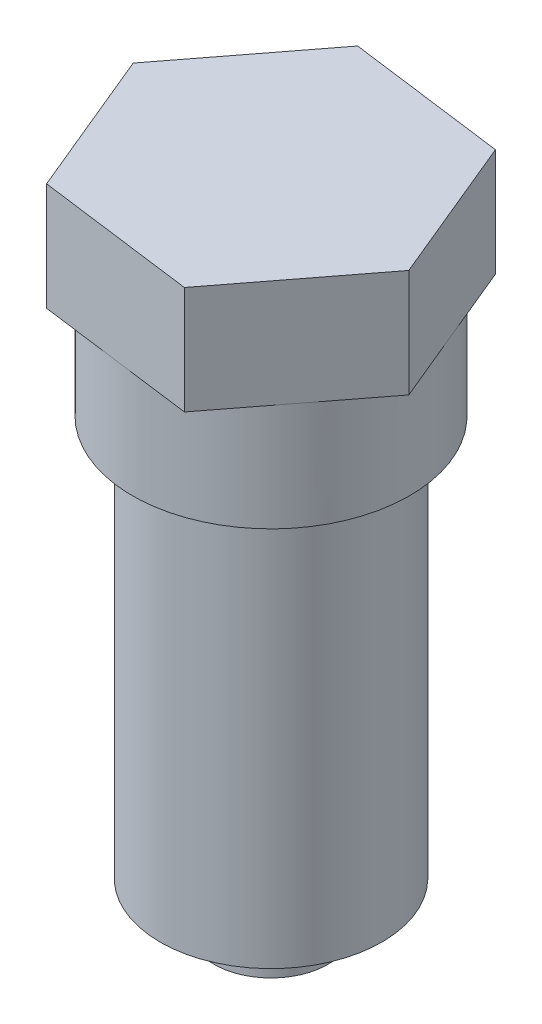
ISO-10303-21;
HEADER;
FILE_DESCRIPTION(('STEP AP214'),'2;1');
FILE_NAME('part.step','',(''),(''),'','','');
FILE_SCHEMA(('AUTOMOTIVE_DESIGN { 1 0 10303 214 1 1 1 1 }'));
ENDSEC;
DATA;
#1=APPLICATION_CONTEXT('core data for automotive mechanical design processes');
#2=APPLICATION_PROTOCOL_DEFINITION('international standard','automotive_design',2000,#1);
#3=PRODUCT_CONTEXT('',#1,'mechanical');
#4=PRODUCT('Part','Part','',(#3));
#5=PRODUCT_RELATED_PRODUCT_CATEGORY('part','',(#4));
#6=PRODUCT_DEFINITION_FORMATION('','',#4);
#7=PRODUCT_DEFINITION_CONTEXT('part definition',#1,'design');
#8=PRODUCT_DEFINITION('design','',#6,#7);
#9=PRODUCT_DEFINITION_SHAPE('','',#8);
#10=(LENGTH_UNIT() NAMED_UNIT(*) SI_UNIT(.MILLI.,.METRE.));
#11=(NAMED_UNIT(*) PLANE_ANGLE_UNIT() SI_UNIT($,.RADIAN.));
#12=(NAMED_UNIT(*) SI_UNIT($,.STERADIAN.) SOLID_ANGLE_UNIT());
#13=UNCERTAINTY_MEASURE_WITH_UNIT(LENGTH_MEASURE(1.E-05),#10,'distance_accuracy_value','');
#14=(GEOMETRIC_REPRESENTATION_CONTEXT(3) GLOBAL_UNCERTAINTY_ASSIGNED_CONTEXT((#13)) GLOBAL_UNIT_ASSIGNED_CONTEXT((#10,
#11,#12)) REPRESENTATION_CONTEXT('',''));
#15=CARTESIAN_POINT('',(0.,0.,0.));
#16=DIRECTION('',(0.,0.,1.));
#17=DIRECTION('',(1.,0.,0.));
#18=AXIS2_PLACEMENT_3D('',#15,#16,#17);
#19=CARTESIAN_POINT('',(0.,0.,0.));
#20=DIRECTION('',(0.,1.,0.));
#21=DIRECTION('',(0.,0.,1.));
#22=AXIS2_PLACEMENT_3D('',#19,#20,#21);
#23=PLANE('',#22);
#24=CARTESIAN_POINT('',(0.,0.,0.));
#25=DIRECTION('',(0.,-1.,0.));
#26=DIRECTION('',(0.,0.,-1.));
#27=AXIS2_PLACEMENT_3D('',#24,#25,#26);
#28=CIRCLE('',#27,9.);
#29=CARTESIAN_POINT('',(1.17416474249469,0.,-8.92307890570751));
#30=VERTEX_POINT('',#29);
#31=CARTESIAN_POINT('',(8.3146953835631,0.,-3.44468295762535));
#32=VERTEX_POINT('',#31);
#33=EDGE_CURVE('E140',#30,#32,#28,.T.);
#34=ORIENTED_EDGE('',*,*,#33,.F.);
#35=DIRECTION('',(-0.991453211745279,0.,-0.130462749166077));
#36=VECTOR('',#35,1.);
#37=CARTESIAN_POINT('',(6.32590675070519,0.,-8.24517457555524));
#38=LINE('',#37,#36);
#39=CARTESIAN_POINT('',(6.32590675070519,0.,-8.24517457555524));
#40=VERTEX_POINT('',#39);
#41=EDGE_CURVE('E122',#40,#30,#38,.T.);
#42=ORIENTED_EDGE('',*,*,#41,.F.);
#43=DIRECTION('',(-0.382742550847261,0.,-0.923855042618122));
#44=VECTOR('',#43,1.);
#45=CARTESIAN_POINT('',(10.303484016421,0.,1.35580866030455));
#46=LINE('',#45,#44);
#47=EDGE_CURVE('E141',#32,#40,#46,.T.);
#48=ORIENTED_EDGE('',*,*,#47,.F.);
#49=EDGE_LOOP('',(#34,#42,#48));
#50=FACE_BOUND('',#49,.T.);
#51=ADVANCED_FACE('F45',(#50),#23,.F.);
#52=CARTESIAN_POINT('',(7.14053064106841,0.,5.47839594808217));
#53=VERTEX_POINT('',#52);
#54=EDGE_CURVE('E149',#32,#53,#28,.T.);
#55=ORIENTED_EDGE('',*,*,#54,.F.);
#56=CARTESIAN_POINT('',(10.303484016421,0.,1.35580866030455));
#57=VERTEX_POINT('',#56);
#58=EDGE_CURVE('E138',#57,#32,#46,.T.);
#59=ORIENTED_EDGE('',*,*,#58,.F.);
#60=DIRECTION('',(0.608710660898019,0.,-0.793392293452046));
#61=VECTOR('',#60,1.);
#62=CARTESIAN_POINT('',(3.97757726571581,0.,9.60098323585979));
#63=LINE('',#62,#61);
#64=EDGE_CURVE('E195',#53,#57,#63,.T.);
#65=ORIENTED_EDGE('',*,*,#64,.F.);
#66=EDGE_LOOP('',(#55,#59,#65));
#67=FACE_BOUND('',#66,.T.);
#68=ADVANCED_FACE('F245',(#67),#23,.F.);
#69=CARTESIAN_POINT('',(-1.17416474249469,0.,8.92307890570751));
#70=VERTEX_POINT('',#69);
#71=EDGE_CURVE('E286',#53,#70,#28,.T.);
#72=ORIENTED_EDGE('',*,*,#71,.F.);
#73=CARTESIAN_POINT('',(3.97757726571581,0.,9.60098323585979));
#74=VERTEX_POINT('',#73);
#75=EDGE_CURVE('E165',#74,#53,#63,.T.);
#76=ORIENTED_EDGE('',*,*,#75,.F.);
#77=DIRECTION('',(0.991453211745279,0.,0.130462749166076));
#78=VECTOR('',#77,1.);
#79=CARTESIAN_POINT('',(-6.32590675070519,0.,8.24517457555524));
#80=LINE('',#79,#78);
#81=EDGE_CURVE('E190',#70,#74,#80,.T.);
#82=ORIENTED_EDGE('',*,*,#81,.F.);
#83=EDGE_LOOP('',(#72,#76,#82));
#84=FACE_BOUND('',#83,.T.);
#85=ADVANCED_FACE('F250',(#84),#23,.F.);
#86=CARTESIAN_POINT('',(-8.3146953835631,0.,3.44468295762534));
#87=VERTEX_POINT('',#86);
#88=EDGE_CURVE('E155',#70,#87,#28,.T.);
#89=ORIENTED_EDGE('',*,*,#88,.F.);
#90=CARTESIAN_POINT('',(-6.32590675070519,0.,8.24517457555524));
#91=VERTEX_POINT('',#90);
#92=EDGE_CURVE('E191',#91,#70,#80,.T.);
#93=ORIENTED_EDGE('',*,*,#92,.F.);
#94=DIRECTION('',(0.38274255084726,0.,0.923855042618122));
#95=VECTOR('',#94,1.);
#96=CARTESIAN_POINT('',(-10.303484016421,0.,-1.35580866030455));
#97=LINE('',#96,#95);
#98=EDGE_CURVE('E185',#87,#91,#97,.T.);
#99=ORIENTED_EDGE('',*,*,#98,.F.);
#100=EDGE_LOOP('',(#89,#93,#99));
#101=FACE_BOUND('',#100,.T.);
#102=ADVANCED_FACE('F273',(#101),#23,.F.);
#103=CARTESIAN_POINT('',(-7.14053064106841,0.,-5.47839594808217));
#104=VERTEX_POINT('',#103);
#105=EDGE_CURVE('E70',#87,#104,#28,.T.);
#106=ORIENTED_EDGE('',*,*,#105,.F.);
#107=CARTESIAN_POINT('',(-10.303484016421,0.,-1.35580866030455));
#108=VERTEX_POINT('',#107);
#109=EDGE_CURVE('E186',#108,#87,#97,.T.);
#110=ORIENTED_EDGE('',*,*,#109,.F.);
#111=DIRECTION('',(-0.608710660898019,0.,0.793392293452046));
#112=VECTOR('',#111,1.);
#113=CARTESIAN_POINT('',(-3.97757726571582,0.,-9.60098323585979));
#114=LINE('',#113,#112);
#115=EDGE_CURVE('E132',#104,#108,#114,.T.);
#116=ORIENTED_EDGE('',*,*,#115,.F.);
#117=EDGE_LOOP('',(#106,#110,#116));
#118=FACE_BOUND('',#117,.T.);
#119=ADVANCED_FACE('F242',(#118),#23,.F.);
#120=CARTESIAN_POINT('',(10.303484016421,7.,1.35580866030455));
#121=DIRECTION('',(-0.923855042618122,0.,0.382742550847261));
#122=DIRECTION('',(0.382742550847261,0.,0.923855042618122));
#123=AXIS2_PLACEMENT_3D('',#120,#121,#122);
#124=PLANE('',#123);
#125=ORIENTED_EDGE('',*,*,#58,.T.);
#126=ORIENTED_EDGE('',*,*,#47,.T.);
#127=DIRECTION('',(0.,-1.,0.));
#128=VECTOR('',#127,1.);
#129=CARTESIAN_POINT('',(6.32590675070519,7.,-8.24517457555524));
#130=LINE('',#129,#128);
#131=CARTESIAN_POINT('',(6.32590675070519,7.,-8.24517457555524));
#132=VERTEX_POINT('',#131);
#133=EDGE_CURVE('E49',#132,#40,#130,.T.);
#134=ORIENTED_EDGE('',*,*,#133,.F.);
#135=DIRECTION('',(-0.382742550847261,0.,-0.923855042618122));
#136=VECTOR('',#135,1.);
#137=CARTESIAN_POINT('',(10.303484016421,7.,1.35580866030455));
#138=LINE('',#137,#136);
#139=CARTESIAN_POINT('',(10.303484016421,7.,1.35580866030455));
#140=VERTEX_POINT('',#139);
#141=EDGE_CURVE('E160',#140,#132,#138,.T.);
#142=ORIENTED_EDGE('',*,*,#141,.F.);
#143=DIRECTION('',(0.,-1.,0.));
#144=VECTOR('',#143,1.);
#145=CARTESIAN_POINT('',(10.303484016421,7.,1.35580866030455));
#146=LINE('',#145,#144);
#147=EDGE_CURVE('E180',#140,#57,#146,.T.);
#148=ORIENTED_EDGE('',*,*,#147,.T.);
#149=EDGE_LOOP('',(#125,#126,#134,#142,#148));
#150=FACE_BOUND('',#149,.T.);
#151=ADVANCED_FACE('F47',(#150),#124,.F.);
#152=CARTESIAN_POINT('',(6.32590675070519,7.,-8.24517457555524));
#153=DIRECTION('',(-0.130462749166077,0.,0.991453211745279));
#154=DIRECTION('',(0.991453211745279,0.,0.130462749166077));
#155=AXIS2_PLACEMENT_3D('',#152,#153,#154);
#156=PLANE('',#155);
#157=ORIENTED_EDGE('',*,*,#41,.T.);
#158=CARTESIAN_POINT('',(-3.97757726571582,0.,-9.60098323585979));
#159=VERTEX_POINT('',#158);
#160=EDGE_CURVE('E125',#30,#159,#38,.T.);
#161=ORIENTED_EDGE('',*,*,#160,.T.);
#162=DIRECTION('',(0.,-1.,0.));
#163=VECTOR('',#162,1.);
#164=CARTESIAN_POINT('',(-3.97757726571582,7.,-9.60098323585979));
#165=LINE('',#164,#163);
#166=CARTESIAN_POINT('',(-3.97757726571582,7.,-9.60098323585979));
#167=VERTEX_POINT('',#166);
#168=EDGE_CURVE('E156',#167,#159,#165,.T.);
#169=ORIENTED_EDGE('',*,*,#168,.F.);
#170=DIRECTION('',(-0.991453211745279,0.,-0.130462749166077));
#171=VECTOR('',#170,1.);
#172=CARTESIAN_POINT('',(6.32590675070519,7.,-8.24517457555524));
#173=LINE('',#172,#171);
#174=EDGE_CURVE('E164',#132,#167,#173,.T.);
#175=ORIENTED_EDGE('',*,*,#174,.F.);
#176=ORIENTED_EDGE('',*,*,#133,.T.);
#177=EDGE_LOOP('',(#157,#161,#169,#175,#176));
#178=FACE_BOUND('',#177,.T.);
#179=ADVANCED_FACE('F123',(#178),#156,.F.);
#180=CARTESIAN_POINT('',(-3.97757726571582,7.,-9.60098323585979));
#181=DIRECTION('',(0.793392293452046,0.,0.608710660898019));
#182=DIRECTION('',(0.608710660898019,0.,-0.793392293452046));
#183=AXIS2_PLACEMENT_3D('',#180,#181,#182);
#184=PLANE('',#183);
#185=EDGE_CURVE('E136',#159,#104,#114,.T.);
#186=ORIENTED_EDGE('',*,*,#185,.T.);
#187=ORIENTED_EDGE('',*,*,#115,.T.);
#188=DIRECTION('',(0.,-1.,0.));
#189=VECTOR('',#188,1.);
#190=CARTESIAN_POINT('',(-10.303484016421,7.,-1.35580866030455));
#191=LINE('',#190,#189);
#192=CARTESIAN_POINT('',(-10.303484016421,7.,-1.35580866030455));
#193=VERTEX_POINT('',#192);
#194=EDGE_CURVE('E210',#193,#108,#191,.T.);
#195=ORIENTED_EDGE('',*,*,#194,.F.);
#196=DIRECTION('',(-0.608710660898019,0.,0.793392293452046));
#197=VECTOR('',#196,1.);
#198=CARTESIAN_POINT('',(-3.97757726571582,7.,-9.60098323585979));
#199=LINE('',#198,#197);
#200=EDGE_CURVE('E168',#167,#193,#199,.T.);
#201=ORIENTED_EDGE('',*,*,#200,.F.);
#202=ORIENTED_EDGE('',*,*,#168,.T.);
#203=EDGE_LOOP('',(#186,#187,#195,#201,#202));
#204=FACE_BOUND('',#203,.T.);
#205=ADVANCED_FACE('F216',(#204),#184,.F.);
#206=CARTESIAN_POINT('',(-10.303484016421,7.,-1.35580866030455));
#207=DIRECTION('',(0.923855042618122,0.,-0.38274255084726));
#208=DIRECTION('',(-0.38274255084726,0.,-0.923855042618122));
#209=AXIS2_PLACEMENT_3D('',#206,#207,#208);
#210=PLANE('',#209);
#211=ORIENTED_EDGE('',*,*,#109,.T.);
#212=ORIENTED_EDGE('',*,*,#98,.T.);
#213=DIRECTION('',(0.,-1.,0.));
#214=VECTOR('',#213,1.);
#215=CARTESIAN_POINT('',(-6.32590675070519,7.,8.24517457555524));
#216=LINE('',#215,#214);
#217=CARTESIAN_POINT('',(-6.32590675070519,7.,8.24517457555524));
#218=VERTEX_POINT('',#217);
#219=EDGE_CURVE('E206',#218,#91,#216,.T.);
#220=ORIENTED_EDGE('',*,*,#219,.F.);
#221=DIRECTION('',(0.38274255084726,0.,0.923855042618122));
#222=VECTOR('',#221,1.);
#223=CARTESIAN_POINT('',(-10.303484016421,7.,-1.35580866030455));
#224=LINE('',#223,#222);
#225=EDGE_CURVE('E171',#193,#218,#224,.T.);
#226=ORIENTED_EDGE('',*,*,#225,.F.);
#227=ORIENTED_EDGE('',*,*,#194,.T.);
#228=EDGE_LOOP('',(#211,#212,#220,#226,#227));
#229=FACE_BOUND('',#228,.T.);
#230=ADVANCED_FACE('F260',(#229),#210,.F.);
#231=CARTESIAN_POINT('',(-6.32590675070519,7.,8.24517457555524));
#232=DIRECTION('',(0.130462749166076,0.,-0.991453211745279));
#233=DIRECTION('',(-0.991453211745279,0.,-0.130462749166076));
#234=AXIS2_PLACEMENT_3D('',#231,#232,#233);
#235=PLANE('',#234);
#236=ORIENTED_EDGE('',*,*,#92,.T.);
#237=ORIENTED_EDGE('',*,*,#81,.T.);
#238=DIRECTION('',(0.,-1.,0.));
#239=VECTOR('',#238,1.);
#240=CARTESIAN_POINT('',(3.97757726571581,7.,9.60098323585979));
#241=LINE('',#240,#239);
#242=CARTESIAN_POINT('',(3.97757726571581,7.,9.60098323585979));
#243=VERTEX_POINT('',#242);
#244=EDGE_CURVE('E202',#243,#74,#241,.T.);
#245=ORIENTED_EDGE('',*,*,#244,.F.);
#246=DIRECTION('',(0.991453211745279,0.,0.130462749166076));
#247=VECTOR('',#246,1.);
#248=CARTESIAN_POINT('',(-6.32590675070519,7.,8.24517457555524));
#249=LINE('',#248,#247);
#250=EDGE_CURVE('E174',#218,#243,#249,.T.);
#251=ORIENTED_EDGE('',*,*,#250,.F.);
#252=ORIENTED_EDGE('',*,*,#219,.T.);
#253=EDGE_LOOP('',(#236,#237,#245,#251,#252));
#254=FACE_BOUND('',#253,.T.);
#255=ADVANCED_FACE('F256',(#254),#235,.F.);
#256=CARTESIAN_POINT('',(3.97757726571581,7.,9.60098323585979));
#257=DIRECTION('',(-0.793392293452046,0.,-0.608710660898019));
#258=DIRECTION('',(-0.608710660898019,0.,0.793392293452046));
#259=AXIS2_PLACEMENT_3D('',#256,#257,#258);
#260=PLANE('',#259);
#261=ORIENTED_EDGE('',*,*,#75,.T.);
#262=ORIENTED_EDGE('',*,*,#64,.T.);
#263=ORIENTED_EDGE('',*,*,#147,.F.);
#264=DIRECTION('',(0.608710660898019,0.,-0.793392293452046));
#265=VECTOR('',#264,1.);
#266=CARTESIAN_POINT('',(3.97757726571581,7.,9.60098323585979));
#267=LINE('',#266,#265);
#268=EDGE_CURVE('E177',#243,#140,#267,.T.);
#269=ORIENTED_EDGE('',*,*,#268,.F.);
#270=ORIENTED_EDGE('',*,*,#244,.T.);
#271=EDGE_LOOP('',(#261,#262,#263,#269,#270));
#272=FACE_BOUND('',#271,.T.);
#273=ADVANCED_FACE('F253',(#272),#260,.F.);
#274=CARTESIAN_POINT('',(0.,7.,0.));
#275=DIRECTION('',(0.,1.,0.));
#276=DIRECTION('',(0.,0.,1.));
#277=AXIS2_PLACEMENT_3D('',#274,#275,#276);
#278=PLANE('',#277);
#279=ORIENTED_EDGE('',*,*,#141,.T.);
#280=ORIENTED_EDGE('',*,*,#174,.T.);
#281=ORIENTED_EDGE('',*,*,#200,.T.);
#282=ORIENTED_EDGE('',*,*,#225,.T.);
#283=ORIENTED_EDGE('',*,*,#250,.T.);
#284=ORIENTED_EDGE('',*,*,#268,.T.);
#285=EDGE_LOOP('',(#279,#280,#281,#282,#283,#284));
#286=FACE_BOUND('',#285,.T.);
#287=ADVANCED_FACE('F220',(#286),#278,.T.);
#288=EDGE_CURVE('E63',#104,#30,#28,.T.);
#289=ORIENTED_EDGE('',*,*,#288,.F.);
#290=ORIENTED_EDGE('',*,*,#185,.F.);
#291=ORIENTED_EDGE('',*,*,#160,.F.);
#292=EDGE_LOOP('',(#289,#290,#291));
#293=FACE_BOUND('',#292,.T.);
#294=ADVANCED_FACE('F134',(#293),#23,.F.);
#295=CARTESIAN_POINT('',(0.,-7.,0.));
#296=DIRECTION('',(0.,1.,0.));
#297=DIRECTION('',(0.,0.,1.));
#298=AXIS2_PLACEMENT_3D('',#295,#296,#297);
#299=CYLINDRICAL_SURFACE('',#298,9.);
#300=CARTESIAN_POINT('',(0.,-7.,0.));
#301=DIRECTION('',(0.,-1.,0.));
#302=DIRECTION('',(0.,0.,-1.));
#303=AXIS2_PLACEMENT_3D('',#300,#301,#302);
#304=CIRCLE('',#303,9.);
#305=CARTESIAN_POINT('',(0.,-7.,-9.));
#306=VERTEX_POINT('',#305);
#307=EDGE_CURVE('E146',#306,#306,#304,.T.);
#308=ORIENTED_EDGE('',*,*,#307,.F.);
#309=EDGE_LOOP('',(#308));
#310=FACE_BOUND('',#309,.T.);
#311=ORIENTED_EDGE('',*,*,#33,.T.);
#312=ORIENTED_EDGE('',*,*,#54,.T.);
#313=ORIENTED_EDGE('',*,*,#71,.T.);
#314=ORIENTED_EDGE('',*,*,#88,.T.);
#315=ORIENTED_EDGE('',*,*,#105,.T.);
#316=ORIENTED_EDGE('',*,*,#288,.T.);
#317=EDGE_LOOP('',(#311,#312,#313,#314,#315,#316));
#318=FACE_BOUND('',#317,.T.);
#319=ADVANCED_FACE('F150',(#310,#318),#299,.T.);
#320=CARTESIAN_POINT('',(0.,-7.,0.));
#321=DIRECTION('',(0.,-1.,0.));
#322=DIRECTION('',(0.,0.,-1.));
#323=AXIS2_PLACEMENT_3D('',#320,#321,#322);
#324=PLANE('',#323);
#325=CARTESIAN_POINT('',(0.,-7.,0.));
#326=DIRECTION('',(0.,-1.,0.));
#327=DIRECTION('',(0.,0.,-1.));
#328=AXIS2_PLACEMENT_3D('',#325,#326,#327);
#329=CIRCLE('',#328,7.2);
#330=CARTESIAN_POINT('',(0.,-7.,7.2));
#331=VERTEX_POINT('',#330);
#332=EDGE_CURVE('E55',#331,#331,#329,.T.);
#333=ORIENTED_EDGE('',*,*,#332,.F.);
#334=EDGE_LOOP('',(#333));
#335=FACE_BOUND('',#334,.T.);
#336=ORIENTED_EDGE('',*,*,#307,.T.);
#337=EDGE_LOOP('',(#336));
#338=FACE_BOUND('',#337,.T.);
#339=ADVANCED_FACE('F230',(#335,#338),#324,.T.);
#340=CARTESIAN_POINT('',(0.,-33.,0.));
#341=DIRECTION('',(0.,1.,0.));
#342=DIRECTION('',(0.,0.,1.));
#343=AXIS2_PLACEMENT_3D('',#340,#341,#342);
#344=CYLINDRICAL_SURFACE('',#343,7.2);
#345=CARTESIAN_POINT('',(0.,-33.,0.));
#346=DIRECTION('',(0.,-1.,0.));
#347=DIRECTION('',(0.,0.,-1.));
#348=AXIS2_PLACEMENT_3D('',#345,#346,#347);
#349=CIRCLE('',#348,7.2);
#350=CARTESIAN_POINT('',(0.,-33.,7.2));
#351=VERTEX_POINT('',#350);
#352=EDGE_CURVE('E147',#351,#351,#349,.T.);
#353=CARTESIAN_POINT('',(0.,-33.,7.2));
#354=CARTESIAN_POINT('',(0.,-32.7291666666667,7.2));
#355=CARTESIAN_POINT('',(0.,-32.4583333333333,7.2));
#356=CARTESIAN_POINT('',(0.,-31.9166666666667,7.2));
#357=CARTESIAN_POINT('',(0.,-31.6458333333333,7.2));
#358=CARTESIAN_POINT('',(0.,-31.1041666666667,7.2));
#359=CARTESIAN_POINT('',(0.,-30.8333333333333,7.2));
#360=CARTESIAN_POINT('',(0.,-30.2916666666667,7.2));
#361=CARTESIAN_POINT('',(0.,-30.0208333333333,7.2));
#362=CARTESIAN_POINT('',(0.,-29.4791666666667,7.2));
#363=CARTESIAN_POINT('',(0.,-29.2083333333333,7.2));
#364=CARTESIAN_POINT('',(0.,-28.6666666666667,7.2));
#365=CARTESIAN_POINT('',(0.,-28.3958333333333,7.2));
#366=CARTESIAN_POINT('',(0.,-27.8541666666667,7.2));
#367=CARTESIAN_POINT('',(0.,-27.5833333333333,7.2));
#368=CARTESIAN_POINT('',(0.,-27.0416666666667,7.2));
#369=CARTESIAN_POINT('',(0.,-26.7708333333333,7.2));
#370=CARTESIAN_POINT('',(0.,-26.2291666666667,7.2));
#371=CARTESIAN_POINT('',(0.,-25.9583333333333,7.2));
#372=CARTESIAN_POINT('',(0.,-25.4166666666667,7.2));
#373=CARTESIAN_POINT('',(0.,-25.1458333333333,7.2));
#374=CARTESIAN_POINT('',(0.,-24.6041666666667,7.2));
#375=CARTESIAN_POINT('',(0.,-24.3333333333333,7.2));
#376=CARTESIAN_POINT('',(0.,-23.7916666666667,7.2));
#377=CARTESIAN_POINT('',(0.,-23.5208333333333,7.2));
#378=CARTESIAN_POINT('',(0.,-22.9791666666667,7.2));
#379=CARTESIAN_POINT('',(0.,-22.7083333333333,7.2));
#380=CARTESIAN_POINT('',(0.,-22.1666666666667,7.2));
#381=CARTESIAN_POINT('',(0.,-21.8958333333333,7.2));
#382=CARTESIAN_POINT('',(0.,-21.3541666666667,7.2));
#383=CARTESIAN_POINT('',(0.,-21.0833333333333,7.2));
#384=CARTESIAN_POINT('',(0.,-20.5416666666667,7.2));
#385=CARTESIAN_POINT('',(0.,-20.2708333333333,7.2));
#386=CARTESIAN_POINT('',(0.,-19.7291666666667,7.2));
#387=CARTESIAN_POINT('',(0.,-19.4583333333333,7.2));
#388=CARTESIAN_POINT('',(0.,-18.9166666666667,7.2));
#389=CARTESIAN_POINT('',(0.,-18.6458333333333,7.2));
#390=CARTESIAN_POINT('',(0.,-18.1041666666667,7.2));
#391=CARTESIAN_POINT('',(0.,-17.8333333333333,7.2));
#392=CARTESIAN_POINT('',(0.,-17.2916666666667,7.2));
#393=CARTESIAN_POINT('',(0.,-17.0208333333333,7.2));
#394=CARTESIAN_POINT('',(0.,-16.4791666666667,7.2));
#395=CARTESIAN_POINT('',(0.,-16.2083333333333,7.2));
#396=CARTESIAN_POINT('',(0.,-15.6666666666667,7.2));
#397=CARTESIAN_POINT('',(0.,-15.3958333333333,7.2));
#398=CARTESIAN_POINT('',(0.,-14.8541666666667,7.2));
#399=CARTESIAN_POINT('',(0.,-14.5833333333333,7.2));
#400=CARTESIAN_POINT('',(0.,-14.0416666666667,7.2));
#401=CARTESIAN_POINT('',(0.,-13.7708333333333,7.2));
#402=CARTESIAN_POINT('',(0.,-13.2291666666667,7.2));
#403=CARTESIAN_POINT('',(0.,-12.9583333333333,7.2));
#404=CARTESIAN_POINT('',(0.,-12.4166666666667,7.2));
#405=CARTESIAN_POINT('',(0.,-12.1458333333333,7.2));
#406=CARTESIAN_POINT('',(0.,-11.6041666666667,7.2));
#407=CARTESIAN_POINT('',(0.,-11.3333333333333,7.2));
#408=CARTESIAN_POINT('',(0.,-10.7916666666667,7.2));
#409=CARTESIAN_POINT('',(0.,-10.5208333333333,7.2));
#410=CARTESIAN_POINT('',(0.,-9.97916666666667,7.2));
#411=CARTESIAN_POINT('',(0.,-9.70833333333333,7.2));
#412=CARTESIAN_POINT('',(0.,-9.16666666666667,7.2));
#413=CARTESIAN_POINT('',(0.,-8.89583333333334,7.2));
#414=CARTESIAN_POINT('',(0.,-8.35416666666667,7.2));
#415=CARTESIAN_POINT('',(0.,-8.08333333333334,7.2));
#416=CARTESIAN_POINT('',(0.,-7.54166666666667,7.2));
#417=CARTESIAN_POINT('',(0.,-7.27083333333334,7.2));
#418=CARTESIAN_POINT('',(0.,-7.,7.2));
#419=B_SPLINE_CURVE_WITH_KNOTS('',3,(#353,#354,#355,#356,#357,#358,#359,#360,#361,#362,#363,
#364,#365,#366,#367,#368,#369,#370,#371,#372,#373,#374,#375,#376,#377,#378,#379,#380,#381,#382,
#383,#384,#385,#386,#387,#388,#389,#390,#391,#392,#393,#394,#395,#396,#397,#398,#399,#400,#401,
#402,#403,#404,#405,#406,#407,#408,#409,#410,#411,#412,#413,#414,#415,#416,#417,#418),
.UNSPECIFIED.,.F.,.F.,(4,2,2,2,2,2,2,2,2,2,2,2,2,2,2,2,2,2,2,2,2,2,2,2,2,2,2,2,2,2,2,2,4),(0.,
0.812500000000001,1.625,2.4375,3.25,4.0625,4.875,5.6875,6.5,7.3125,8.125,8.9375,9.75,10.5625,
11.375,12.1875,13.,13.8125,14.625,15.4375,16.25,17.0625,17.875,18.6875,19.5,20.3125,21.125,
21.9375,22.75,23.5625,24.375,25.1875,26.),.UNSPECIFIED.);
#420=EDGE_CURVE('BSEAM238',#351,#331,#419,.T.);
#421=ORIENTED_EDGE('',*,*,#352,.F.);
#422=ORIENTED_EDGE('',*,*,#332,.T.);
#423=ORIENTED_EDGE('',*,*,#420,.T.);
#424=ORIENTED_EDGE('',*,*,#420,.F.);
#425=EDGE_LOOP('',(#421,#423,#422,#424));
#426=FACE_BOUND('',#425,.T.);
#427=ADVANCED_FACE('F238',(#426),#344,.T.);
#428=CARTESIAN_POINT('',(0.,-33.,0.));
#429=DIRECTION('',(0.,-1.,0.));
#430=DIRECTION('',(0.,0.,-1.));
#431=AXIS2_PLACEMENT_3D('',#428,#429,#430);
#432=PLANE('',#431);
#433=CARTESIAN_POINT('',(0.,-33.,0.));
#434=DIRECTION('',(0.,-1.,0.));
#435=DIRECTION('',(0.,0.,-1.));
#436=AXIS2_PLACEMENT_3D('',#433,#434,#435);
#437=CIRCLE('',#436,3.7);
#438=CARTESIAN_POINT('',(0.,-33.,-3.7));
#439=VERTEX_POINT('',#438);
#440=EDGE_CURVE('E11',#439,#439,#437,.T.);
#441=ORIENTED_EDGE('',*,*,#440,.F.);
#442=EDGE_LOOP('',(#441));
#443=FACE_BOUND('',#442,.T.);
#444=ORIENTED_EDGE('',*,*,#352,.T.);
#445=EDGE_LOOP('',(#444));
#446=FACE_BOUND('',#445,.T.);
#447=ADVANCED_FACE('F313',(#443,#446),#432,.T.);
#448=CARTESIAN_POINT('',(0.,-36.,0.));
#449=DIRECTION('',(0.,1.,0.));
#450=DIRECTION('',(0.,0.,1.));
#451=AXIS2_PLACEMENT_3D('',#448,#449,#450);
#452=CYLINDRICAL_SURFACE('',#451,3.7);
#453=CARTESIAN_POINT('',(0.,-36.,0.));
#454=DIRECTION('',(0.,-1.,0.));
#455=DIRECTION('',(0.,0.,-1.));
#456=AXIS2_PLACEMENT_3D('',#453,#454,#455);
#457=CIRCLE('',#456,3.7);
#458=CARTESIAN_POINT('',(0.,-36.,-3.7));
#459=VERTEX_POINT('',#458);
#460=EDGE_CURVE('E302',#459,#459,#457,.T.);
#461=ORIENTED_EDGE('',*,*,#460,.F.);
#462=EDGE_LOOP('',(#461));
#463=FACE_BOUND('',#462,.T.);
#464=ORIENTED_EDGE('',*,*,#440,.T.);
#465=EDGE_LOOP('',(#464));
#466=FACE_BOUND('',#465,.T.);
#467=ADVANCED_FACE('F310',(#463,#466),#452,.T.);
#468=CARTESIAN_POINT('',(0.,-36.,0.));
#469=DIRECTION('',(0.,-1.,0.));
#470=DIRECTION('',(0.,0.,-1.));
#471=AXIS2_PLACEMENT_3D('',#468,#469,#470);
#472=PLANE('',#471);
#473=ORIENTED_EDGE('',*,*,#460,.T.);
#474=EDGE_LOOP('',(#473));
#475=FACE_BOUND('',#474,.T.);
#476=ADVANCED_FACE('F308',(#475),#472,.T.);
#477=CLOSED_SHELL('',(#51,#68,#85,#102,#119,#151,#179,#205,#230,#255,#273,#287,#294,#319,#339,
#427,#447,#467,#476));
#478=MANIFOLD_SOLID_BREP('B2',#477);
#479=ADVANCED_BREP_SHAPE_REPRESENTATION('',(#18,#478),#14);
#480=SHAPE_DEFINITION_REPRESENTATION(#9,#479);
ENDSEC;
END-ISO-10303-21;
